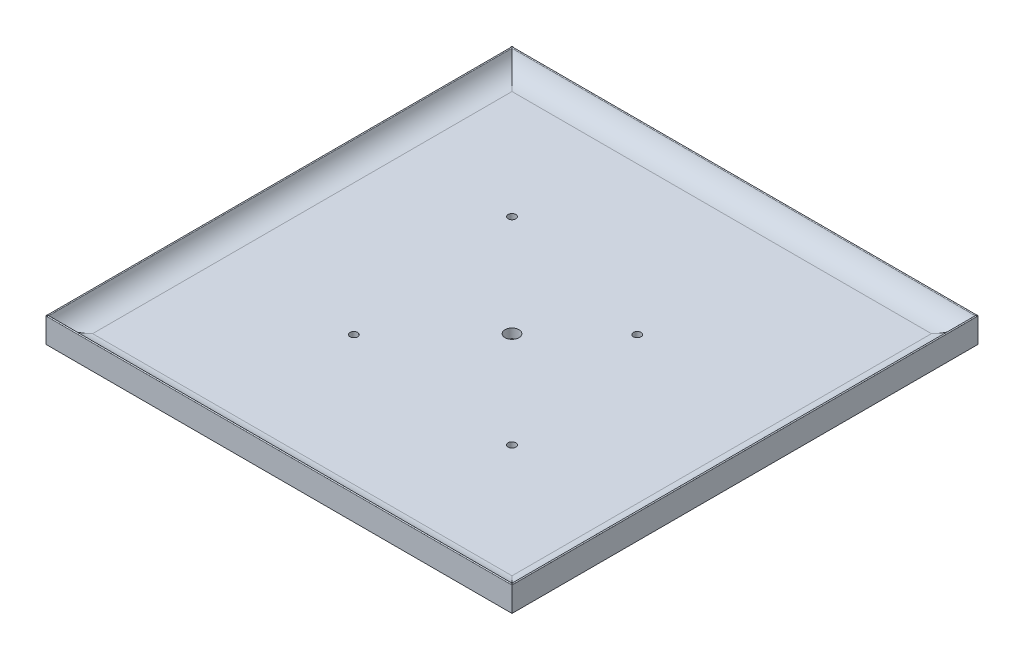
ISO-10303-21;
HEADER;
FILE_DESCRIPTION(('STEP AP214'),'2;1');
FILE_NAME('part.step','',(''),(''),'','','');
FILE_SCHEMA(('AUTOMOTIVE_DESIGN { 1 0 10303 214 1 1 1 1 }'));
ENDSEC;
DATA;
#1=APPLICATION_CONTEXT('core data for automotive mechanical design processes');
#2=APPLICATION_PROTOCOL_DEFINITION('international standard','automotive_design',2000,#1);
#3=PRODUCT_CONTEXT('',#1,'mechanical');
#4=PRODUCT('Part','Part','',(#3));
#5=PRODUCT_RELATED_PRODUCT_CATEGORY('part','',(#4));
#6=PRODUCT_DEFINITION_FORMATION('','',#4);
#7=PRODUCT_DEFINITION_CONTEXT('part definition',#1,'design');
#8=PRODUCT_DEFINITION('design','',#6,#7);
#9=PRODUCT_DEFINITION_SHAPE('','',#8);
#10=(LENGTH_UNIT() NAMED_UNIT(*) SI_UNIT(.MILLI.,.METRE.));
#11=(NAMED_UNIT(*) PLANE_ANGLE_UNIT() SI_UNIT($,.RADIAN.));
#12=(NAMED_UNIT(*) SI_UNIT($,.STERADIAN.) SOLID_ANGLE_UNIT());
#13=UNCERTAINTY_MEASURE_WITH_UNIT(LENGTH_MEASURE(1.E-05),#10,'distance_accuracy_value','');
#14=(GEOMETRIC_REPRESENTATION_CONTEXT(3) GLOBAL_UNCERTAINTY_ASSIGNED_CONTEXT((#13)) GLOBAL_UNIT_ASSIGNED_CONTEXT((#10,
#11,#12)) REPRESENTATION_CONTEXT('',''));
#15=CARTESIAN_POINT('',(0.,0.,0.));
#16=DIRECTION('',(0.,0.,1.));
#17=DIRECTION('',(1.,0.,0.));
#18=AXIS2_PLACEMENT_3D('',#15,#16,#17);
#19=CARTESIAN_POINT('',(100.,14.,90.));
#20=DIRECTION('',(-1.,0.,0.));
#21=DIRECTION('',(0.,0.,1.));
#22=AXIS2_PLACEMENT_3D('',#19,#20,#21);
#23=CYLINDRICAL_SURFACE('',#22,10.);
#24=CARTESIAN_POINT('',(90.,14.,90.));
#25=DIRECTION('',(-0.707106781186547,0.,0.707106781186547));
#26=DIRECTION('',(-0.707106781186547,0.,-0.707106781186547));
#27=AXIS2_PLACEMENT_3D('',#24,#25,#26);
#28=ELLIPSE('',#27,14.142135623731,10.);
#29=CARTESIAN_POINT('',(90.,4.,90.));
#30=VERTEX_POINT('',#29);
#31=CARTESIAN_POINT('',(99.4174757281553,10.6367945484099,99.4174757281554));
#32=VERTEX_POINT('',#31);
#33=EDGE_CURVE('E514',#30,#32,#28,.T.);
#34=ORIENTED_EDGE('',*,*,#33,.F.);
#35=DIRECTION('',(-1.,0.,0.));
#36=VECTOR('',#35,1.);
#37=CARTESIAN_POINT('',(100.,4.,90.));
#38=LINE('',#37,#36);
#39=CARTESIAN_POINT('',(-90.,4.,90.));
#40=VERTEX_POINT('',#39);
#41=EDGE_CURVE('E445',#30,#40,#38,.T.);
#42=ORIENTED_EDGE('',*,*,#41,.T.);
#43=CARTESIAN_POINT('',(-90.,14.,90.));
#44=DIRECTION('',(-0.707106781186547,0.,-0.707106781186547));
#45=DIRECTION('',(-0.707106781186547,0.,0.707106781186547));
#46=AXIS2_PLACEMENT_3D('',#43,#44,#45);
#47=ELLIPSE('',#46,14.142135623731,10.);
#48=CARTESIAN_POINT('',(-99.4174757281553,10.6367945484099,99.4174757281554));
#49=VERTEX_POINT('',#48);
#50=EDGE_CURVE('E307',#49,#40,#47,.F.);
#51=ORIENTED_EDGE('',*,*,#50,.F.);
#52=DIRECTION('',(-1.,0.,0.));
#53=VECTOR('',#52,1.);
#54=CARTESIAN_POINT('',(100.,10.6367945484099,99.4174757281554));
#55=LINE('',#54,#53);
#56=EDGE_CURVE('E376',#32,#49,#55,.T.);
#57=ORIENTED_EDGE('',*,*,#56,.F.);
#58=EDGE_LOOP('',(#34,#42,#51,#57));
#59=FACE_BOUND('',#58,.T.);
#60=ADVANCED_FACE('F37',(#59),#23,.F.);
#61=CARTESIAN_POINT('',(99.9825242718446,10.6367945484099,99.4174757281554));
#62=CARTESIAN_POINT('',(99.9883433479043,10.6203904952379,99.41162012722));
#63=CARTESIAN_POINT('',(99.9927091966138,10.6037804550247,99.4056386427106));
#64=CARTESIAN_POINT('',(99.9985344393335,10.570148400509,99.3934239065413));
#65=CARTESIAN_POINT('',(99.9999938333425,10.5531263862063,99.3871906548811));
#66=CARTESIAN_POINT('',(100.,10.5358983848622,99.3808315196469));
#67=B_SPLINE_CURVE_WITH_KNOTS('',3,(#61,#62,#63,#64,#65,#66),.UNSPECIFIED.,.F.,.F.,(4,2,4),(0.,
0.054558134590104,0.1091162692035),.UNSPECIFIED.);
#68=CARTESIAN_POINT('',(99.9825242718446,10.6367945484099,99.4174757281554));
#69=VERTEX_POINT('',#68);
#70=CARTESIAN_POINT('',(100.,10.5358983848622,99.3808315196469));
#71=VERTEX_POINT('',#70);
#72=EDGE_CURVE('E253',#69,#71,#67,.T.);
#73=ORIENTED_EDGE('',*,*,#72,.F.);
#74=CARTESIAN_POINT('',(100.,10.6367945484099,99.4174757281554));
#75=VERTEX_POINT('',#74);
#76=EDGE_CURVE('E442',#75,#69,#55,.T.);
#77=ORIENTED_EDGE('',*,*,#76,.F.);
#78=CARTESIAN_POINT('',(100.,14.,90.));
#79=DIRECTION('',(-1.,0.,0.));
#80=DIRECTION('',(0.,0.,-1.));
#81=AXIS2_PLACEMENT_3D('',#78,#79,#80);
#82=CIRCLE('',#81,10.);
#83=EDGE_CURVE('E431',#71,#75,#82,.T.);
#84=ORIENTED_EDGE('',*,*,#83,.F.);
#85=EDGE_LOOP('',(#73,#77,#84));
#86=FACE_BOUND('',#85,.T.);
#87=ADVANCED_FACE('F273',(#86),#23,.F.);
#88=CARTESIAN_POINT('',(100.,10.5358983848622,99.7));
#89=DIRECTION('',(-1.,0.,0.));
#90=DIRECTION('',(0.,0.,1.));
#91=AXIS2_PLACEMENT_3D('',#88,#89,#90);
#92=CYLINDRICAL_SURFACE('',#91,0.299999999999993);
#93=CARTESIAN_POINT('',(99.4174757281553,10.6367945484099,99.9825242718447));
#94=CARTESIAN_POINT('',(99.41162012722,10.6203904952379,99.9883433479043));
#95=CARTESIAN_POINT('',(99.4056386427106,10.6037804550247,99.9927091966138));
#96=CARTESIAN_POINT('',(99.3934239065412,10.570148400509,99.9985344393335));
#97=CARTESIAN_POINT('',(99.3871906548811,10.5531263862063,99.9999938333425));
#98=CARTESIAN_POINT('',(99.3808315196468,10.5358983848622,100.));
#99=B_SPLINE_CURVE_WITH_KNOTS('',3,(#93,#94,#95,#96,#97,#98),.UNSPECIFIED.,.F.,.F.,(4,2,4),(0.,
0.0545581345901042,0.109116269203495),.UNSPECIFIED.);
#100=CARTESIAN_POINT('',(99.4174757281553,10.6367945484099,99.9825242718447));
#101=VERTEX_POINT('',#100);
#102=CARTESIAN_POINT('',(99.3808315196468,10.5358983848622,100.));
#103=VERTEX_POINT('',#102);
#104=EDGE_CURVE('E520',#101,#103,#99,.T.);
#105=ORIENTED_EDGE('',*,*,#104,.F.);
#106=CARTESIAN_POINT('',(99.7,10.5358983848622,99.7));
#107=DIRECTION('',(-0.707106781186547,0.,-0.707106781186547));
#108=DIRECTION('',(-0.707106781186547,0.,0.707106781186547));
#109=AXIS2_PLACEMENT_3D('',#106,#107,#108);
#110=ELLIPSE('',#109,0.424264068711923,0.299999999999996);
#111=CARTESIAN_POINT('',(99.7,10.8358983848622,99.7));
#112=VERTEX_POINT('',#111);
#113=EDGE_CURVE('E262',#112,#101,#110,.F.);
#114=ORIENTED_EDGE('',*,*,#113,.F.);
#115=CARTESIAN_POINT('',(99.7,10.5358983848622,99.7));
#116=DIRECTION('',(-0.707106781186547,0.,0.707106781186547));
#117=DIRECTION('',(-0.707106781186547,0.,-0.707106781186547));
#118=AXIS2_PLACEMENT_3D('',#115,#116,#117);
#119=ELLIPSE('',#118,0.424264068711923,0.299999999999996);
#120=EDGE_CURVE('E65',#32,#112,#119,.F.);
#121=ORIENTED_EDGE('',*,*,#120,.F.);
#122=ORIENTED_EDGE('',*,*,#56,.T.);
#123=CARTESIAN_POINT('',(-99.7,10.5358983848622,99.7));
#124=DIRECTION('',(-0.707106781186547,0.,-0.707106781186547));
#125=DIRECTION('',(-0.707106781186547,0.,0.707106781186547));
#126=AXIS2_PLACEMENT_3D('',#123,#124,#125);
#127=ELLIPSE('',#126,0.424264068711923,0.299999999999996);
#128=CARTESIAN_POINT('',(-99.7,10.8358983848622,99.7));
#129=VERTEX_POINT('',#128);
#130=EDGE_CURVE('E290',#129,#49,#127,.T.);
#131=ORIENTED_EDGE('',*,*,#130,.F.);
#132=CARTESIAN_POINT('',(-99.7,10.5358983848622,99.7));
#133=DIRECTION('',(-0.707106781186547,0.,0.707106781186547));
#134=DIRECTION('',(-0.707106781186547,0.,-0.707106781186547));
#135=AXIS2_PLACEMENT_3D('',#132,#133,#134);
#136=ELLIPSE('',#135,0.424264068711923,0.299999999999996);
#137=CARTESIAN_POINT('',(-99.4174757281553,10.6367945484099,99.9825242718447));
#138=VERTEX_POINT('',#137);
#139=EDGE_CURVE('E291',#138,#129,#136,.T.);
#140=ORIENTED_EDGE('',*,*,#139,.F.);
#141=CARTESIAN_POINT('',(-99.3808315196468,10.5358983848622,100.));
#142=CARTESIAN_POINT('',(-99.3871906548811,10.5531263862063,99.9999938333425));
#143=CARTESIAN_POINT('',(-99.3934239065412,10.570148400509,99.9985344393335));
#144=CARTESIAN_POINT('',(-99.4056386427106,10.6037804550247,99.9927091966138));
#145=CARTESIAN_POINT('',(-99.41162012722,10.6203904952379,99.9883433479043));
#146=CARTESIAN_POINT('',(-99.4174757281553,10.6367945484099,99.9825242718447));
#147=B_SPLINE_CURVE_WITH_KNOTS('',3,(#141,#142,#143,#144,#145,#146),.UNSPECIFIED.,.F.,.F.,(4,2,
4),(0.,0.0545581346133859,0.109116269203488),.UNSPECIFIED.);
#148=CARTESIAN_POINT('',(-99.3808315196468,10.5358983848622,100.));
#149=VERTEX_POINT('',#148);
#150=EDGE_CURVE('E301',#149,#138,#147,.T.);
#151=ORIENTED_EDGE('',*,*,#150,.F.);
#152=DIRECTION('',(-1.,0.,0.));
#153=VECTOR('',#152,1.);
#154=CARTESIAN_POINT('',(100.,10.5358983848622,100.));
#155=LINE('',#154,#153);
#156=EDGE_CURVE('E436',#103,#149,#155,.T.);
#157=ORIENTED_EDGE('',*,*,#156,.F.);
#158=EDGE_LOOP('',(#105,#114,#121,#122,#131,#140,#151,#157));
#159=FACE_BOUND('',#158,.T.);
#160=ADVANCED_FACE('F375',(#159),#92,.T.);
#161=CARTESIAN_POINT('',(99.7,10.5358983848622,99.7));
#162=DIRECTION('',(-0.707106781186547,0.,-0.707106781186547));
#163=DIRECTION('',(-0.707106781186547,0.,0.707106781186547));
#164=AXIS2_PLACEMENT_3D('',#161,#162,#163);
#165=ELLIPSE('',#164,0.424264068711923,0.299999999999996);
#166=EDGE_CURVE('E558',#112,#69,#165,.T.);
#167=ORIENTED_EDGE('',*,*,#166,.F.);
#168=CARTESIAN_POINT('',(99.7,10.5358983848622,99.7));
#169=DIRECTION('',(-0.707106781186547,0.,0.707106781186547));
#170=DIRECTION('',(-0.707106781186547,0.,-0.707106781186547));
#171=AXIS2_PLACEMENT_3D('',#168,#169,#170);
#172=ELLIPSE('',#171,0.424264068711923,0.299999999999996);
#173=CARTESIAN_POINT('',(100.,10.5358983848622,100.));
#174=VERTEX_POINT('',#173);
#175=EDGE_CURVE('E58',#174,#112,#172,.T.);
#176=ORIENTED_EDGE('',*,*,#175,.F.);
#177=CARTESIAN_POINT('',(100.,10.5358983848622,99.7));
#178=DIRECTION('',(1.,0.,0.));
#179=DIRECTION('',(0.,0.,-1.));
#180=AXIS2_PLACEMENT_3D('',#177,#178,#179);
#181=CIRCLE('',#180,0.299999999999993);
#182=EDGE_CURVE('E433',#75,#174,#181,.T.);
#183=ORIENTED_EDGE('',*,*,#182,.F.);
#184=ORIENTED_EDGE('',*,*,#76,.T.);
#185=EDGE_LOOP('',(#167,#176,#183,#184));
#186=FACE_BOUND('',#185,.T.);
#187=ADVANCED_FACE('F545',(#186),#92,.T.);
#188=CARTESIAN_POINT('',(100.,14.,-90.));
#189=DIRECTION('',(-1.,0.,0.));
#190=DIRECTION('',(0.,0.,1.));
#191=AXIS2_PLACEMENT_3D('',#188,#189,#190);
#192=CYLINDRICAL_SURFACE('',#191,10.);
#193=CARTESIAN_POINT('',(90.,14.,-90.));
#194=DIRECTION('',(-0.707106781186547,0.,-0.707106781186547));
#195=DIRECTION('',(-0.707106781186547,0.,0.707106781186547));
#196=AXIS2_PLACEMENT_3D('',#193,#194,#195);
#197=ELLIPSE('',#196,14.142135623731,10.);
#198=CARTESIAN_POINT('',(99.4174757281553,10.6367945484099,-99.4174757281554));
#199=VERTEX_POINT('',#198);
#200=CARTESIAN_POINT('',(90.,4.,-90.));
#201=VERTEX_POINT('',#200);
#202=EDGE_CURVE('E387',#199,#201,#197,.T.);
#203=ORIENTED_EDGE('',*,*,#202,.F.);
#204=DIRECTION('',(-1.,0.,0.));
#205=VECTOR('',#204,1.);
#206=CARTESIAN_POINT('',(100.,10.6367945484099,-99.4174757281554));
#207=LINE('',#206,#205);
#208=CARTESIAN_POINT('',(-99.4174757281553,10.6367945484099,-99.4174757281554));
#209=VERTEX_POINT('',#208);
#210=EDGE_CURVE('E385',#199,#209,#207,.T.);
#211=ORIENTED_EDGE('',*,*,#210,.T.);
#212=CARTESIAN_POINT('',(-90.,14.,-90.));
#213=DIRECTION('',(-0.707106781186547,0.,0.707106781186547));
#214=DIRECTION('',(-0.707106781186547,0.,-0.707106781186547));
#215=AXIS2_PLACEMENT_3D('',#212,#213,#214);
#216=ELLIPSE('',#215,14.142135623731,10.);
#217=CARTESIAN_POINT('',(-90.,4.,-90.));
#218=VERTEX_POINT('',#217);
#219=EDGE_CURVE('E298',#218,#209,#216,.F.);
#220=ORIENTED_EDGE('',*,*,#219,.F.);
#221=DIRECTION('',(-1.,0.,0.));
#222=VECTOR('',#221,1.);
#223=CARTESIAN_POINT('',(100.,4.,-90.));
#224=LINE('',#223,#222);
#225=EDGE_CURVE('E382',#201,#218,#224,.T.);
#226=ORIENTED_EDGE('',*,*,#225,.F.);
#227=EDGE_LOOP('',(#203,#211,#220,#226));
#228=FACE_BOUND('',#227,.T.);
#229=ADVANCED_FACE('F238',(#228),#192,.F.);
#230=CARTESIAN_POINT('',(100.,10.5358983848622,-99.3808315196469));
#231=CARTESIAN_POINT('',(99.9999938333425,10.5531263862063,-99.3871906548811));
#232=CARTESIAN_POINT('',(99.9985344393335,10.570148400509,-99.3934239065413));
#233=CARTESIAN_POINT('',(99.9927091966138,10.6037804550247,-99.4056386427106));
#234=CARTESIAN_POINT('',(99.9883433479043,10.6203904952379,-99.41162012722));
#235=CARTESIAN_POINT('',(99.9825242718446,10.6367945484099,-99.4174757281554));
#236=B_SPLINE_CURVE_WITH_KNOTS('',3,(#230,#231,#232,#233,#234,#235),.UNSPECIFIED.,.F.,.F.,(4,2,
4),(0.,0.0545581346133962,0.109116269203505),.UNSPECIFIED.);
#237=CARTESIAN_POINT('',(100.,10.5358983848622,-99.3808315196469));
#238=VERTEX_POINT('',#237);
#239=CARTESIAN_POINT('',(99.9825242718446,10.6367945484099,-99.4174757281554));
#240=VERTEX_POINT('',#239);
#241=EDGE_CURVE('E228',#238,#240,#236,.T.);
#242=ORIENTED_EDGE('',*,*,#241,.F.);
#243=CARTESIAN_POINT('',(100.,14.,-90.));
#244=DIRECTION('',(-1.,0.,0.));
#245=DIRECTION('',(0.,0.,1.));
#246=AXIS2_PLACEMENT_3D('',#243,#244,#245);
#247=CIRCLE('',#246,10.);
#248=CARTESIAN_POINT('',(100.,10.6367945484099,-99.4174757281554));
#249=VERTEX_POINT('',#248);
#250=EDGE_CURVE('E422',#249,#238,#247,.T.);
#251=ORIENTED_EDGE('',*,*,#250,.F.);
#252=EDGE_CURVE('E391',#249,#240,#207,.T.);
#253=ORIENTED_EDGE('',*,*,#252,.T.);
#254=EDGE_LOOP('',(#242,#251,#253));
#255=FACE_BOUND('',#254,.T.);
#256=ADVANCED_FACE('F563',(#255),#192,.F.);
#257=CARTESIAN_POINT('',(100.,10.5358983848622,-99.7));
#258=DIRECTION('',(-1.,0.,0.));
#259=DIRECTION('',(0.,0.,1.));
#260=AXIS2_PLACEMENT_3D('',#257,#258,#259);
#261=CYLINDRICAL_SURFACE('',#260,0.299999999999993);
#262=CARTESIAN_POINT('',(99.7,10.5358983848622,-99.7));
#263=DIRECTION('',(-0.707106781186547,0.,-0.707106781186547));
#264=DIRECTION('',(-0.707106781186547,0.,0.707106781186547));
#265=AXIS2_PLACEMENT_3D('',#262,#263,#264);
#266=ELLIPSE('',#265,0.424264068711923,0.299999999999996);
#267=CARTESIAN_POINT('',(99.7,10.8358983848622,-99.7));
#268=VERTEX_POINT('',#267);
#269=EDGE_CURVE('E561',#268,#199,#266,.F.);
#270=ORIENTED_EDGE('',*,*,#269,.F.);
#271=CARTESIAN_POINT('',(99.7,10.5358983848622,-99.7));
#272=DIRECTION('',(-0.707106781186547,0.,0.707106781186547));
#273=DIRECTION('',(-0.707106781186547,0.,-0.707106781186547));
#274=AXIS2_PLACEMENT_3D('',#271,#272,#273);
#275=ELLIPSE('',#274,0.424264068711923,0.299999999999996);
#276=CARTESIAN_POINT('',(99.4174757281553,10.6367945484099,-99.9825242718447));
#277=VERTEX_POINT('',#276);
#278=EDGE_CURVE('E218',#277,#268,#275,.F.);
#279=ORIENTED_EDGE('',*,*,#278,.F.);
#280=CARTESIAN_POINT('',(99.3808315196468,10.5358983848622,-100.));
#281=CARTESIAN_POINT('',(99.3871906548811,10.5531263862063,-99.9999938333425));
#282=CARTESIAN_POINT('',(99.3934239065412,10.570148400509,-99.9985344393335));
#283=CARTESIAN_POINT('',(99.4056386427106,10.6037804550247,-99.9927091966138));
#284=CARTESIAN_POINT('',(99.41162012722,10.6203904952379,-99.9883433479043));
#285=CARTESIAN_POINT('',(99.4174757281553,10.6367945484099,-99.9825242718447));
#286=B_SPLINE_CURVE_WITH_KNOTS('',3,(#280,#281,#282,#283,#284,#285),.UNSPECIFIED.,.F.,.F.,(4,2,
4),(0.,0.0545581346133859,0.109116269203488),.UNSPECIFIED.);
#287=CARTESIAN_POINT('',(99.3808315196468,10.5358983848622,-100.));
#288=VERTEX_POINT('',#287);
#289=EDGE_CURVE('E200',#288,#277,#286,.T.);
#290=ORIENTED_EDGE('',*,*,#289,.F.);
#291=DIRECTION('',(-1.,0.,0.));
#292=VECTOR('',#291,1.);
#293=CARTESIAN_POINT('',(100.,10.5358983848622,-100.));
#294=LINE('',#293,#292);
#295=CARTESIAN_POINT('',(-99.3808315196468,10.5358983848622,-100.));
#296=VERTEX_POINT('',#295);
#297=EDGE_CURVE('E217',#288,#296,#294,.T.);
#298=ORIENTED_EDGE('',*,*,#297,.T.);
#299=CARTESIAN_POINT('',(-99.4174757281553,10.6367945484099,-99.9825242718446));
#300=CARTESIAN_POINT('',(-99.41162012722,10.6203904952379,-99.9883433479043));
#301=CARTESIAN_POINT('',(-99.4056386427106,10.6037804550247,-99.9927091966138));
#302=CARTESIAN_POINT('',(-99.3934239065412,10.570148400509,-99.9985344393335));
#303=CARTESIAN_POINT('',(-99.3871906548811,10.5531263862063,-99.9999938333425));
#304=CARTESIAN_POINT('',(-99.3808315196468,10.5358983848622,-100.));
#305=B_SPLINE_CURVE_WITH_KNOTS('',3,(#299,#300,#301,#302,#303,#304),.UNSPECIFIED.,.F.,.F.,(4,2,
4),(0.,0.0545581345901043,0.109116269203493),.UNSPECIFIED.);
#306=CARTESIAN_POINT('',(-99.4174757281553,10.6367945484099,-99.9825242718447));
#307=VERTEX_POINT('',#306);
#308=EDGE_CURVE('E11',#307,#296,#305,.T.);
#309=ORIENTED_EDGE('',*,*,#308,.F.);
#310=CARTESIAN_POINT('',(-99.7,10.5358983848622,-99.7));
#311=DIRECTION('',(-0.707106781186547,0.,-0.707106781186547));
#312=DIRECTION('',(-0.707106781186547,0.,0.707106781186547));
#313=AXIS2_PLACEMENT_3D('',#310,#311,#312);
#314=ELLIPSE('',#313,0.424264068711923,0.299999999999996);
#315=CARTESIAN_POINT('',(-99.7,10.8358983848622,-99.7));
#316=VERTEX_POINT('',#315);
#317=EDGE_CURVE('E397',#316,#307,#314,.T.);
#318=ORIENTED_EDGE('',*,*,#317,.F.);
#319=CARTESIAN_POINT('',(-99.7,10.5358983848622,-99.7));
#320=DIRECTION('',(-0.707106781186547,0.,0.707106781186547));
#321=DIRECTION('',(-0.707106781186547,0.,-0.707106781186547));
#322=AXIS2_PLACEMENT_3D('',#319,#320,#321);
#323=ELLIPSE('',#322,0.424264068711923,0.299999999999996);
#324=EDGE_CURVE('E395',#209,#316,#323,.T.);
#325=ORIENTED_EDGE('',*,*,#324,.F.);
#326=ORIENTED_EDGE('',*,*,#210,.F.);
#327=EDGE_LOOP('',(#270,#279,#290,#298,#309,#318,#325,#326));
#328=FACE_BOUND('',#327,.T.);
#329=ADVANCED_FACE('F396',(#328),#261,.T.);
#330=CARTESIAN_POINT('',(99.7,10.5358983848622,-99.7));
#331=DIRECTION('',(-0.707106781186547,0.,-0.707106781186547));
#332=DIRECTION('',(-0.707106781186547,0.,0.707106781186547));
#333=AXIS2_PLACEMENT_3D('',#330,#331,#332);
#334=ELLIPSE('',#333,0.424264068711923,0.299999999999996);
#335=CARTESIAN_POINT('',(100.,10.5358983848622,-100.));
#336=VERTEX_POINT('',#335);
#337=EDGE_CURVE('E211',#268,#336,#334,.T.);
#338=ORIENTED_EDGE('',*,*,#337,.F.);
#339=CARTESIAN_POINT('',(99.7,10.5358983848622,-99.7));
#340=DIRECTION('',(-0.707106781186547,0.,0.707106781186547));
#341=DIRECTION('',(-0.707106781186547,0.,-0.707106781186547));
#342=AXIS2_PLACEMENT_3D('',#339,#340,#341);
#343=ELLIPSE('',#342,0.424264068711923,0.299999999999996);
#344=EDGE_CURVE('E220',#240,#268,#343,.T.);
#345=ORIENTED_EDGE('',*,*,#344,.F.);
#346=ORIENTED_EDGE('',*,*,#252,.F.);
#347=CARTESIAN_POINT('',(100.,10.5358983848622,-99.7));
#348=DIRECTION('',(1.,0.,0.));
#349=DIRECTION('',(0.,0.,1.));
#350=AXIS2_PLACEMENT_3D('',#347,#348,#349);
#351=CIRCLE('',#350,0.299999999999993);
#352=EDGE_CURVE('E418',#336,#249,#351,.T.);
#353=ORIENTED_EDGE('',*,*,#352,.F.);
#354=EDGE_LOOP('',(#338,#345,#346,#353));
#355=FACE_BOUND('',#354,.T.);
#356=ADVANCED_FACE('F546',(#355),#261,.T.);
#357=CARTESIAN_POINT('',(0.,4.,0.));
#358=DIRECTION('',(0.,1.,0.));
#359=DIRECTION('',(0.,0.,1.));
#360=AXIS2_PLACEMENT_3D('',#357,#358,#359);
#361=PLANE('',#360);
#362=CARTESIAN_POINT('',(-33.5875721063612,4.,34.2946788875473));
#363=DIRECTION('',(0.,1.,0.));
#364=DIRECTION('',(0.,0.,1.));
#365=AXIS2_PLACEMENT_3D('',#362,#363,#364);
#366=CIRCLE('',#365,1.64999999999781);
#367=CARTESIAN_POINT('',(-33.5875721063612,4.,35.9446788875451));
#368=VERTEX_POINT('',#367);
#369=EDGE_CURVE('E454',#368,#368,#366,.T.);
#370=ORIENTED_EDGE('',*,*,#369,.F.);
#371=EDGE_LOOP('',(#370));
#372=FACE_BOUND('',#371,.T.);
#373=CARTESIAN_POINT('',(27.2236110756823,4.,-26.5165042944954));
#374=DIRECTION('',(0.,1.,0.));
#375=DIRECTION('',(0.,0.,1.));
#376=AXIS2_PLACEMENT_3D('',#373,#374,#375);
#377=CIRCLE('',#376,1.64999999999781);
#378=CARTESIAN_POINT('',(27.2236110756823,4.,-24.8665042944975));
#379=VERTEX_POINT('',#378);
#380=EDGE_CURVE('E466',#379,#379,#377,.T.);
#381=ORIENTED_EDGE('',*,*,#380,.F.);
#382=EDGE_LOOP('',(#381));
#383=FACE_BOUND('',#382,.T.);
#384=CARTESIAN_POINT('',(0.,4.,0.));
#385=DIRECTION('',(0.,1.,0.));
#386=DIRECTION('',(0.,0.,1.));
#387=AXIS2_PLACEMENT_3D('',#384,#385,#386);
#388=CIRCLE('',#387,3.);
#389=CARTESIAN_POINT('',(0.,4.,2.99999999999997));
#390=VERTEX_POINT('',#389);
#391=EDGE_CURVE('E472',#390,#390,#388,.T.);
#392=ORIENTED_EDGE('',*,*,#391,.F.);
#393=EDGE_LOOP('',(#392));
#394=FACE_BOUND('',#393,.T.);
#395=CARTESIAN_POINT('',(-43.4870670429723,4.,-43.487067042973));
#396=DIRECTION('',(0.,1.,0.));
#397=DIRECTION('',(0.,0.,1.));
#398=AXIS2_PLACEMENT_3D('',#395,#396,#397);
#399=CIRCLE('',#398,1.64999999999781);
#400=CARTESIAN_POINT('',(-43.4870670429723,4.,-41.8370670429752));
#401=VERTEX_POINT('',#400);
#402=EDGE_CURVE('E460',#401,#401,#399,.T.);
#403=ORIENTED_EDGE('',*,*,#402,.F.);
#404=EDGE_LOOP('',(#403));
#405=FACE_BOUND('',#404,.T.);
#406=CARTESIAN_POINT('',(41.3657466994128,4.,41.3657466994133));
#407=DIRECTION('',(0.,1.,0.));
#408=DIRECTION('',(0.,0.,1.));
#409=AXIS2_PLACEMENT_3D('',#406,#407,#408);
#410=CIRCLE('',#409,1.64999999999781);
#411=CARTESIAN_POINT('',(41.3657466994128,4.,43.0157466994111));
#412=VERTEX_POINT('',#411);
#413=EDGE_CURVE('E448',#412,#412,#410,.T.);
#414=ORIENTED_EDGE('',*,*,#413,.F.);
#415=EDGE_LOOP('',(#414));
#416=FACE_BOUND('',#415,.T.);
#417=ORIENTED_EDGE('',*,*,#41,.F.);
#418=DIRECTION('',(0.,0.,-1.));
#419=VECTOR('',#418,1.);
#420=CARTESIAN_POINT('',(90.,4.,100.));
#421=LINE('',#420,#419);
#422=EDGE_CURVE('E529',#30,#201,#421,.T.);
#423=ORIENTED_EDGE('',*,*,#422,.T.);
#424=ORIENTED_EDGE('',*,*,#225,.T.);
#425=DIRECTION('',(0.,0.,-1.));
#426=VECTOR('',#425,1.);
#427=CARTESIAN_POINT('',(-90.,4.,100.));
#428=LINE('',#427,#426);
#429=EDGE_CURVE('E348',#40,#218,#428,.T.);
#430=ORIENTED_EDGE('',*,*,#429,.F.);
#431=EDGE_LOOP('',(#417,#423,#424,#430));
#432=FACE_BOUND('',#431,.T.);
#433=ADVANCED_FACE('F537',(#372,#383,#394,#405,#416,#432),#361,.T.);
#434=CARTESIAN_POINT('',(-100.,10.5358983848622,99.3808315196469));
#435=CARTESIAN_POINT('',(-99.9999938333425,10.5531263862063,99.3871906548811));
#436=CARTESIAN_POINT('',(-99.9985344393335,10.570148400509,99.3934239065413));
#437=CARTESIAN_POINT('',(-99.9927091966138,10.6037804550247,99.4056386427106));
#438=CARTESIAN_POINT('',(-99.9883433479043,10.6203904952379,99.41162012722));
#439=CARTESIAN_POINT('',(-99.9825242718446,10.6367945484099,99.4174757281554));
#440=B_SPLINE_CURVE_WITH_KNOTS('',3,(#434,#435,#436,#437,#438,#439),.UNSPECIFIED.,.F.,.F.,(4,2,
4),(0.,0.0545581346133962,0.109116269203505),.UNSPECIFIED.);
#441=CARTESIAN_POINT('',(-100.,10.5358983848622,99.3808315196469));
#442=VERTEX_POINT('',#441);
#443=CARTESIAN_POINT('',(-99.9825242718446,10.6367945484099,99.4174757281554));
#444=VERTEX_POINT('',#443);
#445=EDGE_CURVE('E282',#442,#444,#440,.T.);
#446=ORIENTED_EDGE('',*,*,#445,.F.);
#447=CARTESIAN_POINT('',(-100.,14.,90.));
#448=DIRECTION('',(-1.,0.,0.));
#449=DIRECTION('',(0.,0.,-1.));
#450=AXIS2_PLACEMENT_3D('',#447,#448,#449);
#451=CIRCLE('',#450,10.);
#452=CARTESIAN_POINT('',(-100.,10.6367945484099,99.4174757281554));
#453=VERTEX_POINT('',#452);
#454=EDGE_CURVE('E437',#442,#453,#451,.T.);
#455=ORIENTED_EDGE('',*,*,#454,.T.);
#456=EDGE_CURVE('E441',#444,#453,#55,.T.);
#457=ORIENTED_EDGE('',*,*,#456,.F.);
#458=EDGE_LOOP('',(#446,#455,#457));
#459=FACE_BOUND('',#458,.T.);
#460=ADVANCED_FACE('F275',(#459),#23,.F.);
#461=CARTESIAN_POINT('',(-99.7,10.5358983848622,99.7));
#462=DIRECTION('',(-0.707106781186547,0.,-0.707106781186547));
#463=DIRECTION('',(-0.707106781186547,0.,0.707106781186547));
#464=AXIS2_PLACEMENT_3D('',#461,#462,#463);
#465=ELLIPSE('',#464,0.424264068711923,0.299999999999996);
#466=CARTESIAN_POINT('',(-100.,10.5358983848622,100.));
#467=VERTEX_POINT('',#466);
#468=EDGE_CURVE('E295',#129,#467,#465,.F.);
#469=ORIENTED_EDGE('',*,*,#468,.F.);
#470=CARTESIAN_POINT('',(-99.7,10.5358983848622,99.7));
#471=DIRECTION('',(-0.707106781186547,0.,0.707106781186547));
#472=DIRECTION('',(-0.707106781186547,0.,-0.707106781186547));
#473=AXIS2_PLACEMENT_3D('',#470,#471,#472);
#474=ELLIPSE('',#473,0.424264068711923,0.299999999999996);
#475=EDGE_CURVE('E358',#444,#129,#474,.F.);
#476=ORIENTED_EDGE('',*,*,#475,.F.);
#477=ORIENTED_EDGE('',*,*,#456,.T.);
#478=CARTESIAN_POINT('',(-100.,10.5358983848622,99.7));
#479=DIRECTION('',(1.,0.,0.));
#480=DIRECTION('',(0.,0.,-1.));
#481=AXIS2_PLACEMENT_3D('',#478,#479,#480);
#482=CIRCLE('',#481,0.299999999999993);
#483=EDGE_CURVE('E374',#453,#467,#482,.T.);
#484=ORIENTED_EDGE('',*,*,#483,.T.);
#485=EDGE_LOOP('',(#469,#476,#477,#484));
#486=FACE_BOUND('',#485,.T.);
#487=ADVANCED_FACE('F276',(#486),#92,.T.);
#488=CARTESIAN_POINT('',(-99.9825242718447,10.6367945484099,-99.4174757281554));
#489=CARTESIAN_POINT('',(-99.9883433479043,10.6203904952379,-99.41162012722));
#490=CARTESIAN_POINT('',(-99.9927091966138,10.6037804550247,-99.4056386427106));
#491=CARTESIAN_POINT('',(-99.9985344393335,10.570148400509,-99.3934239065413));
#492=CARTESIAN_POINT('',(-99.9999938333425,10.5531263862063,-99.3871906548811));
#493=CARTESIAN_POINT('',(-100.,10.5358983848622,-99.3808315196469));
#494=B_SPLINE_CURVE_WITH_KNOTS('',3,(#488,#489,#490,#491,#492,#493),.UNSPECIFIED.,.F.,.F.,(4,2,
4),(0.,0.0545581345901006,0.109116269203497),.UNSPECIFIED.);
#495=CARTESIAN_POINT('',(-99.9825242718446,10.6367945484099,-99.4174757281554));
#496=VERTEX_POINT('',#495);
#497=CARTESIAN_POINT('',(-100.,10.5358983848622,-99.3808315196469));
#498=VERTEX_POINT('',#497);
#499=EDGE_CURVE('E354',#496,#498,#494,.T.);
#500=ORIENTED_EDGE('',*,*,#499,.F.);
#501=CARTESIAN_POINT('',(-100.,10.6367945484099,-99.4174757281554));
#502=VERTEX_POINT('',#501);
#503=EDGE_CURVE('E392',#496,#502,#207,.T.);
#504=ORIENTED_EDGE('',*,*,#503,.T.);
#505=CARTESIAN_POINT('',(-100.,14.,-90.));
#506=DIRECTION('',(-1.,0.,0.));
#507=DIRECTION('',(0.,0.,1.));
#508=AXIS2_PLACEMENT_3D('',#505,#506,#507);
#509=CIRCLE('',#508,10.);
#510=EDGE_CURVE('E429',#502,#498,#509,.T.);
#511=ORIENTED_EDGE('',*,*,#510,.T.);
#512=EDGE_LOOP('',(#500,#504,#511));
#513=FACE_BOUND('',#512,.T.);
#514=ADVANCED_FACE('F544',(#513),#192,.F.);
#515=CARTESIAN_POINT('',(-99.7,10.5358983848622,-99.7));
#516=DIRECTION('',(-0.707106781186547,0.,-0.707106781186547));
#517=DIRECTION('',(-0.707106781186547,0.,0.707106781186547));
#518=AXIS2_PLACEMENT_3D('',#515,#516,#517);
#519=ELLIPSE('',#518,0.424264068711923,0.299999999999996);
#520=EDGE_CURVE('E51',#316,#496,#519,.F.);
#521=ORIENTED_EDGE('',*,*,#520,.F.);
#522=CARTESIAN_POINT('',(-99.7,10.5358983848622,-99.7));
#523=DIRECTION('',(-0.707106781186547,0.,0.707106781186547));
#524=DIRECTION('',(-0.707106781186547,0.,-0.707106781186547));
#525=AXIS2_PLACEMENT_3D('',#522,#523,#524);
#526=ELLIPSE('',#525,0.424264068711923,0.299999999999996);
#527=CARTESIAN_POINT('',(-100.,10.5358983848622,-100.));
#528=VERTEX_POINT('',#527);
#529=EDGE_CURVE('E400',#528,#316,#526,.F.);
#530=ORIENTED_EDGE('',*,*,#529,.F.);
#531=CARTESIAN_POINT('',(-100.,10.5358983848622,-99.7));
#532=DIRECTION('',(1.,0.,0.));
#533=DIRECTION('',(0.,0.,1.));
#534=AXIS2_PLACEMENT_3D('',#531,#532,#533);
#535=CIRCLE('',#534,0.299999999999993);
#536=EDGE_CURVE('E412',#528,#502,#535,.T.);
#537=ORIENTED_EDGE('',*,*,#536,.T.);
#538=ORIENTED_EDGE('',*,*,#503,.F.);
#539=EDGE_LOOP('',(#521,#530,#537,#538));
#540=FACE_BOUND('',#539,.T.);
#541=ADVANCED_FACE('F410',(#540),#261,.T.);
#542=CARTESIAN_POINT('',(0.,0.,0.));
#543=DIRECTION('',(0.,1.,0.));
#544=DIRECTION('',(0.,0.,1.));
#545=AXIS2_PLACEMENT_3D('',#542,#543,#544);
#546=PLANE('',#545);
#547=DIRECTION('',(0.,0.,-1.));
#548=VECTOR('',#547,1.);
#549=CARTESIAN_POINT('',(100.,0.,-100.));
#550=LINE('',#549,#548);
#551=CARTESIAN_POINT('',(100.,0.,100.));
#552=VERTEX_POINT('',#551);
#553=CARTESIAN_POINT('',(100.,0.,-100.));
#554=VERTEX_POINT('',#553);
#555=EDGE_CURVE('E475',#552,#554,#550,.T.);
#556=ORIENTED_EDGE('',*,*,#555,.F.);
#557=DIRECTION('',(1.,0.,0.));
#558=VECTOR('',#557,1.);
#559=CARTESIAN_POINT('',(-100.,0.,100.));
#560=LINE('',#559,#558);
#561=CARTESIAN_POINT('',(-100.,0.,100.));
#562=VERTEX_POINT('',#561);
#563=EDGE_CURVE('E486',#562,#552,#560,.T.);
#564=ORIENTED_EDGE('',*,*,#563,.F.);
#565=DIRECTION('',(0.,0.,1.));
#566=VECTOR('',#565,1.);
#567=CARTESIAN_POINT('',(-100.,0.,-100.));
#568=LINE('',#567,#566);
#569=CARTESIAN_POINT('',(-100.,0.,-100.));
#570=VERTEX_POINT('',#569);
#571=EDGE_CURVE('E483',#570,#562,#568,.T.);
#572=ORIENTED_EDGE('',*,*,#571,.F.);
#573=DIRECTION('',(-1.,0.,0.));
#574=VECTOR('',#573,1.);
#575=CARTESIAN_POINT('',(-100.,0.,-100.));
#576=LINE('',#575,#574);
#577=EDGE_CURVE('E480',#554,#570,#576,.T.);
#578=ORIENTED_EDGE('',*,*,#577,.F.);
#579=EDGE_LOOP('',(#556,#564,#572,#578));
#580=FACE_BOUND('',#579,.T.);
#581=CARTESIAN_POINT('',(0.,0.,0.));
#582=DIRECTION('',(0.,1.,0.));
#583=DIRECTION('',(0.,0.,1.));
#584=AXIS2_PLACEMENT_3D('',#581,#582,#583);
#585=CIRCLE('',#584,3.);
#586=CARTESIAN_POINT('',(0.,0.,2.99999999999997));
#587=VERTEX_POINT('',#586);
#588=EDGE_CURVE('E469',#587,#587,#585,.T.);
#589=ORIENTED_EDGE('',*,*,#588,.T.);
#590=EDGE_LOOP('',(#589));
#591=FACE_BOUND('',#590,.T.);
#592=CARTESIAN_POINT('',(27.2236110756823,0.,-26.5165042944954));
#593=DIRECTION('',(0.,1.,0.));
#594=DIRECTION('',(0.,0.,1.));
#595=AXIS2_PLACEMENT_3D('',#592,#593,#594);
#596=CIRCLE('',#595,1.64999999999781);
#597=CARTESIAN_POINT('',(27.2236110756823,0.,-24.8665042944975));
#598=VERTEX_POINT('',#597);
#599=EDGE_CURVE('E463',#598,#598,#596,.T.);
#600=ORIENTED_EDGE('',*,*,#599,.T.);
#601=EDGE_LOOP('',(#600));
#602=FACE_BOUND('',#601,.T.);
#603=CARTESIAN_POINT('',(-43.4870670429723,0.,-43.487067042973));
#604=DIRECTION('',(0.,1.,0.));
#605=DIRECTION('',(0.,0.,1.));
#606=AXIS2_PLACEMENT_3D('',#603,#604,#605);
#607=CIRCLE('',#606,1.64999999999781);
#608=CARTESIAN_POINT('',(-43.4870670429723,0.,-41.8370670429752));
#609=VERTEX_POINT('',#608);
#610=EDGE_CURVE('E457',#609,#609,#607,.T.);
#611=ORIENTED_EDGE('',*,*,#610,.T.);
#612=EDGE_LOOP('',(#611));
#613=FACE_BOUND('',#612,.T.);
#614=CARTESIAN_POINT('',(-33.5875721063612,0.,34.2946788875473));
#615=DIRECTION('',(0.,1.,0.));
#616=DIRECTION('',(0.,0.,1.));
#617=AXIS2_PLACEMENT_3D('',#614,#615,#616);
#618=CIRCLE('',#617,1.64999999999781);
#619=CARTESIAN_POINT('',(-33.5875721063612,0.,35.9446788875451));
#620=VERTEX_POINT('',#619);
#621=EDGE_CURVE('E451',#620,#620,#618,.T.);
#622=ORIENTED_EDGE('',*,*,#621,.T.);
#623=EDGE_LOOP('',(#622));
#624=FACE_BOUND('',#623,.T.);
#625=CARTESIAN_POINT('',(41.3657466994128,0.,41.3657466994133));
#626=DIRECTION('',(0.,1.,0.));
#627=DIRECTION('',(0.,0.,1.));
#628=AXIS2_PLACEMENT_3D('',#625,#626,#627);
#629=CIRCLE('',#628,1.64999999999781);
#630=CARTESIAN_POINT('',(41.3657466994128,0.,43.0157466994111));
#631=VERTEX_POINT('',#630);
#632=EDGE_CURVE('E447',#631,#631,#629,.T.);
#633=ORIENTED_EDGE('',*,*,#632,.T.);
#634=EDGE_LOOP('',(#633));
#635=FACE_BOUND('',#634,.T.);
#636=ADVANCED_FACE('F499',(#580,#591,#602,#613,#624,#635),#546,.F.);
#637=CARTESIAN_POINT('',(100.,4.,-100.));
#638=DIRECTION('',(-1.,0.,0.));
#639=DIRECTION('',(0.,0.,1.));
#640=AXIS2_PLACEMENT_3D('',#637,#638,#639);
#641=PLANE('',#640);
#642=DIRECTION('',(0.,0.,-1.));
#643=VECTOR('',#642,1.);
#644=CARTESIAN_POINT('',(100.,10.5358983848622,100.));
#645=LINE('',#644,#643);
#646=EDGE_CURVE('E204',#71,#238,#645,.T.);
#647=ORIENTED_EDGE('',*,*,#646,.F.);
#648=ORIENTED_EDGE('',*,*,#83,.T.);
#649=ORIENTED_EDGE('',*,*,#182,.T.);
#650=DIRECTION('',(0.,-1.,0.));
#651=VECTOR('',#650,1.);
#652=CARTESIAN_POINT('',(100.,4.,100.));
#653=LINE('',#652,#651);
#654=EDGE_CURVE('E489',#174,#552,#653,.T.);
#655=ORIENTED_EDGE('',*,*,#654,.T.);
#656=ORIENTED_EDGE('',*,*,#555,.T.);
#657=DIRECTION('',(0.,-1.,0.));
#658=VECTOR('',#657,1.);
#659=CARTESIAN_POINT('',(100.,4.,-100.));
#660=LINE('',#659,#658);
#661=EDGE_CURVE('E403',#336,#554,#660,.T.);
#662=ORIENTED_EDGE('',*,*,#661,.F.);
#663=ORIENTED_EDGE('',*,*,#352,.T.);
#664=ORIENTED_EDGE('',*,*,#250,.T.);
#665=EDGE_LOOP('',(#647,#648,#649,#655,#656,#662,#663,#664));
#666=FACE_BOUND('',#665,.T.);
#667=ADVANCED_FACE('F39',(#666),#641,.F.);
#668=CARTESIAN_POINT('',(-100.,4.,-100.));
#669=DIRECTION('',(0.,0.,1.));
#670=DIRECTION('',(1.,0.,0.));
#671=AXIS2_PLACEMENT_3D('',#668,#669,#670);
#672=PLANE('',#671);
#673=ORIENTED_EDGE('',*,*,#297,.F.);
#674=CARTESIAN_POINT('',(90.,14.,-100.));
#675=DIRECTION('',(0.,0.,-1.));
#676=DIRECTION('',(-1.,0.,0.));
#677=AXIS2_PLACEMENT_3D('',#674,#675,#676);
#678=CIRCLE('',#677,10.);
#679=CARTESIAN_POINT('',(99.4174757281553,10.6367945484099,-100.));
#680=VERTEX_POINT('',#679);
#681=EDGE_CURVE('E198',#680,#288,#678,.T.);
#682=ORIENTED_EDGE('',*,*,#681,.F.);
#683=CARTESIAN_POINT('',(99.7,10.5358983848622,-100.));
#684=DIRECTION('',(0.,0.,1.));
#685=DIRECTION('',(-1.,0.,0.));
#686=AXIS2_PLACEMENT_3D('',#683,#684,#685);
#687=CIRCLE('',#686,0.299999999999999);
#688=EDGE_CURVE('E209',#336,#680,#687,.T.);
#689=ORIENTED_EDGE('',*,*,#688,.F.);
#690=ORIENTED_EDGE('',*,*,#661,.T.);
#691=ORIENTED_EDGE('',*,*,#577,.T.);
#692=DIRECTION('',(0.,-1.,0.));
#693=VECTOR('',#692,1.);
#694=CARTESIAN_POINT('',(-100.,4.,-100.));
#695=LINE('',#694,#693);
#696=EDGE_CURVE('E493',#528,#570,#695,.T.);
#697=ORIENTED_EDGE('',*,*,#696,.F.);
#698=CARTESIAN_POINT('',(-99.7,10.5358983848622,-100.));
#699=DIRECTION('',(0.,0.,1.));
#700=DIRECTION('',(1.,0.,0.));
#701=AXIS2_PLACEMENT_3D('',#698,#699,#700);
#702=CIRCLE('',#701,0.299999999999999);
#703=CARTESIAN_POINT('',(-99.4174757281553,10.6367945484099,-100.));
#704=VERTEX_POINT('',#703);
#705=EDGE_CURVE('E510',#704,#528,#702,.T.);
#706=ORIENTED_EDGE('',*,*,#705,.F.);
#707=CARTESIAN_POINT('',(-90.,14.,-100.));
#708=DIRECTION('',(0.,0.,-1.));
#709=DIRECTION('',(1.,0.,0.));
#710=AXIS2_PLACEMENT_3D('',#707,#708,#709);
#711=CIRCLE('',#710,10.);
#712=EDGE_CURVE('E334',#296,#704,#711,.T.);
#713=ORIENTED_EDGE('',*,*,#712,.F.);
#714=EDGE_LOOP('',(#673,#682,#689,#690,#691,#697,#706,#713));
#715=FACE_BOUND('',#714,.T.);
#716=ADVANCED_FACE('F215',(#715),#672,.F.);
#717=CARTESIAN_POINT('',(-100.,4.,-100.));
#718=DIRECTION('',(1.,0.,0.));
#719=DIRECTION('',(0.,0.,-1.));
#720=AXIS2_PLACEMENT_3D('',#717,#718,#719);
#721=PLANE('',#720);
#722=ORIENTED_EDGE('',*,*,#454,.F.);
#723=DIRECTION('',(0.,0.,-1.));
#724=VECTOR('',#723,1.);
#725=CARTESIAN_POINT('',(-100.,10.5358983848622,100.));
#726=LINE('',#725,#724);
#727=EDGE_CURVE('E339',#442,#498,#726,.T.);
#728=ORIENTED_EDGE('',*,*,#727,.T.);
#729=ORIENTED_EDGE('',*,*,#510,.F.);
#730=ORIENTED_EDGE('',*,*,#536,.F.);
#731=ORIENTED_EDGE('',*,*,#696,.T.);
#732=ORIENTED_EDGE('',*,*,#571,.T.);
#733=DIRECTION('',(0.,-1.,0.));
#734=VECTOR('',#733,1.);
#735=CARTESIAN_POINT('',(-100.,4.,100.));
#736=LINE('',#735,#734);
#737=EDGE_CURVE('E491',#467,#562,#736,.T.);
#738=ORIENTED_EDGE('',*,*,#737,.F.);
#739=ORIENTED_EDGE('',*,*,#483,.F.);
#740=EDGE_LOOP('',(#722,#728,#729,#730,#731,#732,#738,#739));
#741=FACE_BOUND('',#740,.T.);
#742=ADVANCED_FACE('F509',(#741),#721,.F.);
#743=CARTESIAN_POINT('',(-100.,4.,100.));
#744=DIRECTION('',(0.,0.,-1.));
#745=DIRECTION('',(-1.,0.,0.));
#746=AXIS2_PLACEMENT_3D('',#743,#744,#745);
#747=PLANE('',#746);
#748=ORIENTED_EDGE('',*,*,#654,.F.);
#749=CARTESIAN_POINT('',(99.7,10.5358983848622,100.));
#750=DIRECTION('',(0.,0.,1.));
#751=DIRECTION('',(-1.,0.,0.));
#752=AXIS2_PLACEMENT_3D('',#749,#750,#751);
#753=CIRCLE('',#752,0.299999999999999);
#754=CARTESIAN_POINT('',(99.4174757281553,10.6367945484099,100.));
#755=VERTEX_POINT('',#754);
#756=EDGE_CURVE('E223',#174,#755,#753,.T.);
#757=ORIENTED_EDGE('',*,*,#756,.T.);
#758=CARTESIAN_POINT('',(90.,14.,100.));
#759=DIRECTION('',(0.,0.,-1.));
#760=DIRECTION('',(-1.,0.,0.));
#761=AXIS2_PLACEMENT_3D('',#758,#759,#760);
#762=CIRCLE('',#761,10.);
#763=EDGE_CURVE('E213',#755,#103,#762,.T.);
#764=ORIENTED_EDGE('',*,*,#763,.T.);
#765=ORIENTED_EDGE('',*,*,#156,.T.);
#766=CARTESIAN_POINT('',(-90.,14.,100.));
#767=DIRECTION('',(0.,0.,-1.));
#768=DIRECTION('',(1.,0.,0.));
#769=AXIS2_PLACEMENT_3D('',#766,#767,#768);
#770=CIRCLE('',#769,10.);
#771=CARTESIAN_POINT('',(-99.4174757281553,10.6367945484099,100.));
#772=VERTEX_POINT('',#771);
#773=EDGE_CURVE('E511',#149,#772,#770,.T.);
#774=ORIENTED_EDGE('',*,*,#773,.T.);
#775=CARTESIAN_POINT('',(-99.7,10.5358983848622,100.));
#776=DIRECTION('',(0.,0.,1.));
#777=DIRECTION('',(1.,0.,0.));
#778=AXIS2_PLACEMENT_3D('',#775,#776,#777);
#779=CIRCLE('',#778,0.299999999999999);
#780=EDGE_CURVE('E344',#772,#467,#779,.T.);
#781=ORIENTED_EDGE('',*,*,#780,.T.);
#782=ORIENTED_EDGE('',*,*,#737,.T.);
#783=ORIENTED_EDGE('',*,*,#563,.T.);
#784=EDGE_LOOP('',(#748,#757,#764,#765,#774,#781,#782,#783));
#785=FACE_BOUND('',#784,.T.);
#786=ADVANCED_FACE('F506',(#785),#747,.F.);
#787=CARTESIAN_POINT('',(0.,4.,0.));
#788=DIRECTION('',(0.,-1.,0.));
#789=DIRECTION('',(0.,0.,-1.));
#790=AXIS2_PLACEMENT_3D('',#787,#788,#789);
#791=CYLINDRICAL_SURFACE('',#790,3.);
#792=ORIENTED_EDGE('',*,*,#391,.T.);
#793=EDGE_LOOP('',(#792));
#794=FACE_BOUND('',#793,.T.);
#795=ORIENTED_EDGE('',*,*,#588,.F.);
#796=EDGE_LOOP('',(#795));
#797=FACE_BOUND('',#796,.T.);
#798=ADVANCED_FACE('F644',(#794,#797),#791,.F.);
#799=CARTESIAN_POINT('',(27.2236110756823,4.,-26.5165042944954));
#800=DIRECTION('',(0.,-1.,0.));
#801=DIRECTION('',(0.,0.,-1.));
#802=AXIS2_PLACEMENT_3D('',#799,#800,#801);
#803=CYLINDRICAL_SURFACE('',#802,1.64999999999781);
#804=ORIENTED_EDGE('',*,*,#380,.T.);
#805=EDGE_LOOP('',(#804));
#806=FACE_BOUND('',#805,.T.);
#807=ORIENTED_EDGE('',*,*,#599,.F.);
#808=EDGE_LOOP('',(#807));
#809=FACE_BOUND('',#808,.T.);
#810=ADVANCED_FACE('F828',(#806,#809),#803,.F.);
#811=CARTESIAN_POINT('',(-43.4870670429723,4.,-43.487067042973));
#812=DIRECTION('',(0.,-1.,0.));
#813=DIRECTION('',(0.,0.,-1.));
#814=AXIS2_PLACEMENT_3D('',#811,#812,#813);
#815=CYLINDRICAL_SURFACE('',#814,1.64999999999781);
#816=ORIENTED_EDGE('',*,*,#402,.T.);
#817=EDGE_LOOP('',(#816));
#818=FACE_BOUND('',#817,.T.);
#819=ORIENTED_EDGE('',*,*,#610,.F.);
#820=EDGE_LOOP('',(#819));
#821=FACE_BOUND('',#820,.T.);
#822=ADVANCED_FACE('F818',(#818,#821),#815,.F.);
#823=CARTESIAN_POINT('',(-33.5875721063612,4.,34.2946788875473));
#824=DIRECTION('',(0.,-1.,0.));
#825=DIRECTION('',(0.,0.,-1.));
#826=AXIS2_PLACEMENT_3D('',#823,#824,#825);
#827=CYLINDRICAL_SURFACE('',#826,1.64999999999781);
#828=ORIENTED_EDGE('',*,*,#369,.T.);
#829=EDGE_LOOP('',(#828));
#830=FACE_BOUND('',#829,.T.);
#831=ORIENTED_EDGE('',*,*,#621,.F.);
#832=EDGE_LOOP('',(#831));
#833=FACE_BOUND('',#832,.T.);
#834=ADVANCED_FACE('F808',(#830,#833),#827,.F.);
#835=CARTESIAN_POINT('',(41.3657466994128,4.,41.3657466994133));
#836=DIRECTION('',(0.,-1.,0.));
#837=DIRECTION('',(0.,0.,-1.));
#838=AXIS2_PLACEMENT_3D('',#835,#836,#837);
#839=CYLINDRICAL_SURFACE('',#838,1.64999999999781);
#840=ORIENTED_EDGE('',*,*,#413,.T.);
#841=EDGE_LOOP('',(#840));
#842=FACE_BOUND('',#841,.T.);
#843=ORIENTED_EDGE('',*,*,#632,.F.);
#844=EDGE_LOOP('',(#843));
#845=FACE_BOUND('',#844,.T.);
#846=ADVANCED_FACE('F278',(#842,#845),#839,.F.);
#847=CARTESIAN_POINT('',(-99.7,10.5358983848622,100.));
#848=DIRECTION('',(0.,0.,-1.));
#849=DIRECTION('',(-1.,0.,0.));
#850=AXIS2_PLACEMENT_3D('',#847,#848,#849);
#851=CYLINDRICAL_SURFACE('',#850,0.299999999999999);
#852=ORIENTED_EDGE('',*,*,#529,.T.);
#853=ORIENTED_EDGE('',*,*,#317,.T.);
#854=DIRECTION('',(0.,0.,-1.));
#855=VECTOR('',#854,1.);
#856=CARTESIAN_POINT('',(-99.4174757281553,10.6367945484099,100.));
#857=LINE('',#856,#855);
#858=EDGE_CURVE('E333',#307,#704,#857,.T.);
#859=ORIENTED_EDGE('',*,*,#858,.T.);
#860=ORIENTED_EDGE('',*,*,#705,.T.);
#861=EDGE_LOOP('',(#852,#853,#859,#860));
#862=FACE_BOUND('',#861,.T.);
#863=ADVANCED_FACE('F323',(#862),#851,.T.);
#864=CARTESIAN_POINT('',(-90.,14.,100.));
#865=DIRECTION('',(0.,0.,-1.));
#866=DIRECTION('',(-1.,0.,0.));
#867=AXIS2_PLACEMENT_3D('',#864,#865,#866);
#868=CYLINDRICAL_SURFACE('',#867,10.);
#869=ORIENTED_EDGE('',*,*,#858,.F.);
#870=ORIENTED_EDGE('',*,*,#308,.T.);
#871=ORIENTED_EDGE('',*,*,#712,.T.);
#872=EDGE_LOOP('',(#869,#870,#871));
#873=FACE_BOUND('',#872,.T.);
#874=ADVANCED_FACE('F315',(#873),#868,.F.);
#875=ORIENTED_EDGE('',*,*,#475,.T.);
#876=ORIENTED_EDGE('',*,*,#130,.T.);
#877=EDGE_CURVE('E338',#49,#209,#857,.T.);
#878=ORIENTED_EDGE('',*,*,#877,.T.);
#879=ORIENTED_EDGE('',*,*,#324,.T.);
#880=ORIENTED_EDGE('',*,*,#520,.T.);
#881=ORIENTED_EDGE('',*,*,#499,.T.);
#882=ORIENTED_EDGE('',*,*,#727,.F.);
#883=ORIENTED_EDGE('',*,*,#445,.T.);
#884=EDGE_LOOP('',(#875,#876,#878,#879,#880,#881,#882,#883));
#885=FACE_BOUND('',#884,.T.);
#886=ADVANCED_FACE('F313',(#885),#851,.T.);
#887=ORIENTED_EDGE('',*,*,#877,.F.);
#888=ORIENTED_EDGE('',*,*,#50,.T.);
#889=ORIENTED_EDGE('',*,*,#429,.T.);
#890=ORIENTED_EDGE('',*,*,#219,.T.);
#891=EDGE_LOOP('',(#887,#888,#889,#890));
#892=FACE_BOUND('',#891,.T.);
#893=ADVANCED_FACE('F309',(#892),#868,.F.);
#894=ORIENTED_EDGE('',*,*,#773,.F.);
#895=ORIENTED_EDGE('',*,*,#150,.T.);
#896=EDGE_CURVE('E341',#772,#138,#857,.T.);
#897=ORIENTED_EDGE('',*,*,#896,.F.);
#898=EDGE_LOOP('',(#894,#895,#897));
#899=FACE_BOUND('',#898,.T.);
#900=ADVANCED_FACE('F312',(#899),#868,.F.);
#901=ORIENTED_EDGE('',*,*,#139,.T.);
#902=ORIENTED_EDGE('',*,*,#468,.T.);
#903=ORIENTED_EDGE('',*,*,#780,.F.);
#904=ORIENTED_EDGE('',*,*,#896,.T.);
#905=EDGE_LOOP('',(#901,#902,#903,#904));
#906=FACE_BOUND('',#905,.T.);
#907=ADVANCED_FACE('F249',(#906),#851,.T.);
#908=CARTESIAN_POINT('',(90.,14.,100.));
#909=DIRECTION('',(0.,0.,-1.));
#910=DIRECTION('',(-1.,0.,0.));
#911=AXIS2_PLACEMENT_3D('',#908,#909,#910);
#912=CYLINDRICAL_SURFACE('',#911,10.);
#913=ORIENTED_EDGE('',*,*,#422,.F.);
#914=ORIENTED_EDGE('',*,*,#33,.T.);
#915=DIRECTION('',(0.,0.,-1.));
#916=VECTOR('',#915,1.);
#917=CARTESIAN_POINT('',(99.4174757281553,10.6367945484099,100.));
#918=LINE('',#917,#916);
#919=EDGE_CURVE('E203',#32,#199,#918,.T.);
#920=ORIENTED_EDGE('',*,*,#919,.T.);
#921=ORIENTED_EDGE('',*,*,#202,.T.);
#922=EDGE_LOOP('',(#913,#914,#920,#921));
#923=FACE_BOUND('',#922,.T.);
#924=ADVANCED_FACE('F245',(#923),#912,.F.);
#925=CARTESIAN_POINT('',(99.7,10.5358983848622,100.));
#926=DIRECTION('',(0.,0.,-1.));
#927=DIRECTION('',(-1.,0.,0.));
#928=AXIS2_PLACEMENT_3D('',#925,#926,#927);
#929=CYLINDRICAL_SURFACE('',#928,0.299999999999999);
#930=ORIENTED_EDGE('',*,*,#166,.T.);
#931=ORIENTED_EDGE('',*,*,#72,.T.);
#932=ORIENTED_EDGE('',*,*,#646,.T.);
#933=ORIENTED_EDGE('',*,*,#241,.T.);
#934=ORIENTED_EDGE('',*,*,#344,.T.);
#935=ORIENTED_EDGE('',*,*,#269,.T.);
#936=ORIENTED_EDGE('',*,*,#919,.F.);
#937=ORIENTED_EDGE('',*,*,#120,.T.);
#938=EDGE_LOOP('',(#930,#931,#932,#933,#934,#935,#936,#937));
#939=FACE_BOUND('',#938,.T.);
#940=ADVANCED_FACE('F240',(#939),#929,.T.);
#941=ORIENTED_EDGE('',*,*,#278,.T.);
#942=ORIENTED_EDGE('',*,*,#337,.T.);
#943=ORIENTED_EDGE('',*,*,#688,.T.);
#944=EDGE_CURVE('E194',#277,#680,#918,.T.);
#945=ORIENTED_EDGE('',*,*,#944,.F.);
#946=EDGE_LOOP('',(#941,#942,#943,#945));
#947=FACE_BOUND('',#946,.T.);
#948=ADVANCED_FACE('F210',(#947),#929,.T.);
#949=ORIENTED_EDGE('',*,*,#681,.T.);
#950=ORIENTED_EDGE('',*,*,#289,.T.);
#951=ORIENTED_EDGE('',*,*,#944,.T.);
#952=EDGE_LOOP('',(#949,#950,#951));
#953=FACE_BOUND('',#952,.T.);
#954=ADVANCED_FACE('F196',(#953),#912,.F.);
#955=EDGE_CURVE('E206',#755,#101,#918,.T.);
#956=ORIENTED_EDGE('',*,*,#955,.T.);
#957=ORIENTED_EDGE('',*,*,#104,.T.);
#958=ORIENTED_EDGE('',*,*,#763,.F.);
#959=EDGE_LOOP('',(#956,#957,#958));
#960=FACE_BOUND('',#959,.T.);
#961=ADVANCED_FACE('F694',(#960),#912,.F.);
#962=ORIENTED_EDGE('',*,*,#175,.T.);
#963=ORIENTED_EDGE('',*,*,#113,.T.);
#964=ORIENTED_EDGE('',*,*,#955,.F.);
#965=ORIENTED_EDGE('',*,*,#756,.F.);
#966=EDGE_LOOP('',(#962,#963,#964,#965));
#967=FACE_BOUND('',#966,.T.);
#968=ADVANCED_FACE('F247',(#967),#929,.T.);
#969=CLOSED_SHELL('',(#60,#87,#160,#187,#229,#256,#329,#356,#433,#460,#487,#514,#541,#636,#667,
#716,#742,#786,#798,#810,#822,#834,#846,#863,#874,#886,#893,#900,#907,#924,#940,#948,#954,#961,#968));
#970=MANIFOLD_SOLID_BREP('B2',#969);
#971=ADVANCED_BREP_SHAPE_REPRESENTATION('',(#18,#970),#14);
#972=SHAPE_DEFINITION_REPRESENTATION(#9,#971);
ENDSEC;
END-ISO-10303-21;
